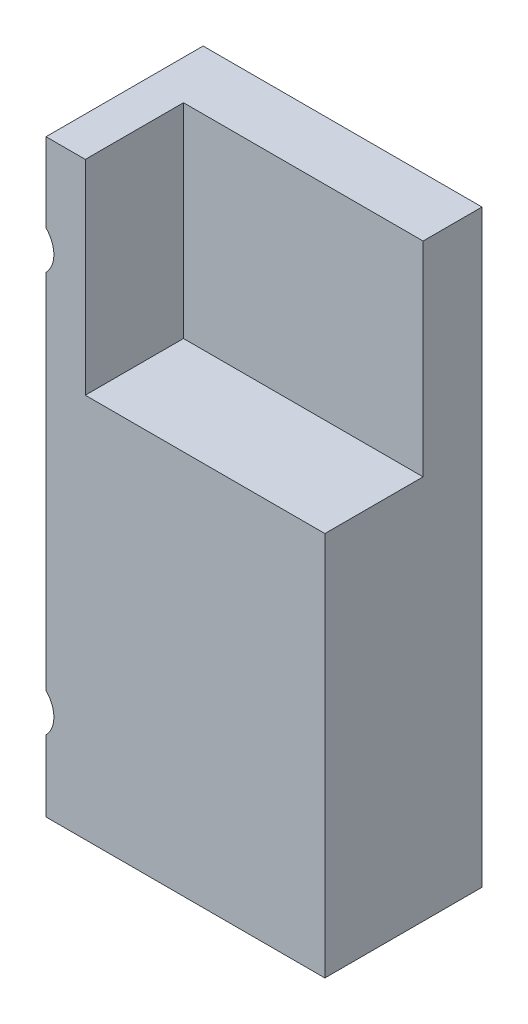
ISO-10303-21;
HEADER;
FILE_DESCRIPTION(('STEP AP214'),'2;1');
FILE_NAME('part.step','',(''),(''),'','','');
FILE_SCHEMA(('AUTOMOTIVE_DESIGN { 1 0 10303 214 1 1 1 1 }'));
ENDSEC;
DATA;
#1=APPLICATION_CONTEXT('core data for automotive mechanical design processes');
#2=APPLICATION_PROTOCOL_DEFINITION('international standard','automotive_design',2000,#1);
#3=PRODUCT_CONTEXT('',#1,'mechanical');
#4=PRODUCT('Part','Part','',(#3));
#5=PRODUCT_RELATED_PRODUCT_CATEGORY('part','',(#4));
#6=PRODUCT_DEFINITION_FORMATION('','',#4);
#7=PRODUCT_DEFINITION_CONTEXT('part definition',#1,'design');
#8=PRODUCT_DEFINITION('design','',#6,#7);
#9=PRODUCT_DEFINITION_SHAPE('','',#8);
#10=(LENGTH_UNIT() NAMED_UNIT(*) SI_UNIT(.MILLI.,.METRE.));
#11=(NAMED_UNIT(*) PLANE_ANGLE_UNIT() SI_UNIT($,.RADIAN.));
#12=(NAMED_UNIT(*) SI_UNIT($,.STERADIAN.) SOLID_ANGLE_UNIT());
#13=UNCERTAINTY_MEASURE_WITH_UNIT(LENGTH_MEASURE(1.E-05),#10,'distance_accuracy_value','');
#14=(GEOMETRIC_REPRESENTATION_CONTEXT(3) GLOBAL_UNCERTAINTY_ASSIGNED_CONTEXT((#13)) GLOBAL_UNIT_ASSIGNED_CONTEXT((#10,
#11,#12)) REPRESENTATION_CONTEXT('',''));
#15=CARTESIAN_POINT('',(0.,0.,0.));
#16=DIRECTION('',(0.,0.,1.));
#17=DIRECTION('',(1.,0.,0.));
#18=AXIS2_PLACEMENT_3D('',#15,#16,#17);
#19=CARTESIAN_POINT('',(-7.06427759792682,9.69793994413408,3.81));
#20=DIRECTION('',(1.,0.,0.));
#21=DIRECTION('',(0.,1.,0.));
#22=AXIS2_PLACEMENT_3D('',#19,#20,#21);
#23=PLANE('',#22);
#24=DIRECTION('',(0.,0.,-1.));
#25=VECTOR('',#24,1.);
#26=CARTESIAN_POINT('',(-7.06427759792682,2.10359915480021,12.192));
#27=LINE('',#26,#25);
#28=CARTESIAN_POINT('',(-7.06427759792682,2.10359915480021,0.));
#29=VERTEX_POINT('',#28);
#30=CARTESIAN_POINT('',(-7.06427759792682,2.10359915480022,10.16));
#31=VERTEX_POINT('',#30);
#32=EDGE_CURVE('E55',#29,#31,#27,.F.);
#33=ORIENTED_EDGE('',*,*,#32,.F.);
#34=DIRECTION('',(0.,-1.,0.));
#35=VECTOR('',#34,1.);
#36=CARTESIAN_POINT('',(-7.06427759792682,9.69793994413408,0.));
#37=LINE('',#36,#35);
#38=CARTESIAN_POINT('',(-7.06427759792682,-21.3157192665321,0.));
#39=VERTEX_POINT('',#38);
#40=EDGE_CURVE('E128',#29,#39,#37,.T.);
#41=ORIENTED_EDGE('',*,*,#40,.T.);
#42=DIRECTION('',(0.,0.,-1.));
#43=VECTOR('',#42,1.);
#44=CARTESIAN_POINT('',(-7.06427759792682,-21.3157192665321,12.192));
#45=LINE('',#44,#43);
#46=CARTESIAN_POINT('',(-7.06427759792682,-21.3157192665321,10.16));
#47=VERTEX_POINT('',#46);
#48=EDGE_CURVE('E113',#47,#39,#45,.T.);
#49=ORIENTED_EDGE('',*,*,#48,.F.);
#50=DIRECTION('',(0.,-1.,0.));
#51=VECTOR('',#50,1.);
#52=CARTESIAN_POINT('',(-7.06427759792682,-28.4020600558659,10.16));
#53=LINE('',#52,#51);
#54=EDGE_CURVE('E190',#31,#47,#53,.T.);
#55=ORIENTED_EDGE('',*,*,#54,.F.);
#56=EDGE_LOOP('',(#33,#41,#49,#55));
#57=FACE_BOUND('',#56,.T.);
#58=ADVANCED_FACE('F33',(#57),#23,.F.);
#59=DIRECTION('',(0.,0.,-1.));
#60=VECTOR('',#59,1.);
#61=CARTESIAN_POINT('',(-7.06427759792682,4.59228073346794,12.192));
#62=LINE('',#61,#60);
#63=CARTESIAN_POINT('',(-7.06427759792682,4.59228073346794,10.16));
#64=VERTEX_POINT('',#63);
#65=CARTESIAN_POINT('',(-7.06427759792682,4.59228073346794,0.));
#66=VERTEX_POINT('',#65);
#67=EDGE_CURVE('E201',#64,#66,#62,.T.);
#68=ORIENTED_EDGE('',*,*,#67,.F.);
#69=CARTESIAN_POINT('',(-7.06427759792682,9.69793994413408,10.16));
#70=VERTEX_POINT('',#69);
#71=EDGE_CURVE('E187',#70,#64,#53,.T.);
#72=ORIENTED_EDGE('',*,*,#71,.F.);
#73=DIRECTION('',(0.,0.,-1.));
#74=VECTOR('',#73,1.);
#75=CARTESIAN_POINT('',(-7.06427759792682,9.69793994413408,3.81));
#76=LINE('',#75,#74);
#77=CARTESIAN_POINT('',(-7.06427759792682,9.69793994413408,0.));
#78=VERTEX_POINT('',#77);
#79=EDGE_CURVE('E143',#70,#78,#76,.T.);
#80=ORIENTED_EDGE('',*,*,#79,.T.);
#81=EDGE_CURVE('E132',#78,#66,#37,.T.);
#82=ORIENTED_EDGE('',*,*,#81,.T.);
#83=EDGE_LOOP('',(#68,#72,#80,#82));
#84=FACE_BOUND('',#83,.T.);
#85=ADVANCED_FACE('F206',(#84),#23,.F.);
#86=DIRECTION('',(0.,0.,-1.));
#87=VECTOR('',#86,1.);
#88=CARTESIAN_POINT('',(-7.06427759792682,-23.8044008451998,12.192));
#89=LINE('',#88,#87);
#90=CARTESIAN_POINT('',(-7.06427759792682,-23.8044008451998,0.));
#91=VERTEX_POINT('',#90);
#92=CARTESIAN_POINT('',(-7.06427759792682,-23.8044008451998,10.16));
#93=VERTEX_POINT('',#92);
#94=EDGE_CURVE('E48',#91,#93,#89,.F.);
#95=ORIENTED_EDGE('',*,*,#94,.F.);
#96=CARTESIAN_POINT('',(-7.06427759792682,-28.4020600558659,0.));
#97=VERTEX_POINT('',#96);
#98=EDGE_CURVE('E130',#91,#97,#37,.T.);
#99=ORIENTED_EDGE('',*,*,#98,.T.);
#100=DIRECTION('',(0.,0.,-1.));
#101=VECTOR('',#100,1.);
#102=CARTESIAN_POINT('',(-7.06427759792682,-28.4020600558659,3.81));
#103=LINE('',#102,#101);
#104=CARTESIAN_POINT('',(-7.06427759792682,-28.4020600558659,10.16));
#105=VERTEX_POINT('',#104);
#106=EDGE_CURVE('E140',#105,#97,#103,.T.);
#107=ORIENTED_EDGE('',*,*,#106,.F.);
#108=EDGE_CURVE('E179',#93,#105,#53,.T.);
#109=ORIENTED_EDGE('',*,*,#108,.F.);
#110=EDGE_LOOP('',(#95,#99,#107,#109));
#111=FACE_BOUND('',#110,.T.);
#112=ADVANCED_FACE('F228',(#111),#23,.F.);
#113=CARTESIAN_POINT('',(0.,0.,3.81));
#114=DIRECTION('',(0.,0.,-1.));
#115=DIRECTION('',(-1.,0.,0.));
#116=AXIS2_PLACEMENT_3D('',#113,#114,#115);
#117=PLANE('',#116);
#118=DIRECTION('',(0.,1.,0.));
#119=VECTOR('',#118,1.);
#120=CARTESIAN_POINT('',(-4.52427759792682,-28.4020600558659,3.81));
#121=LINE('',#120,#119);
#122=CARTESIAN_POINT('',(-4.52427759792682,-3.51006005586593,3.81));
#123=VERTEX_POINT('',#122);
#124=CARTESIAN_POINT('',(-4.52427759792682,9.69793994413408,3.81));
#125=VERTEX_POINT('',#124);
#126=EDGE_CURVE('E177',#123,#125,#121,.T.);
#127=ORIENTED_EDGE('',*,*,#126,.F.);
#128=DIRECTION('',(-1.,0.,0.));
#129=VECTOR('',#128,1.);
#130=CARTESIAN_POINT('',(10.9697224020732,-3.51006005586593,3.81));
#131=LINE('',#130,#129);
#132=CARTESIAN_POINT('',(10.9697224020732,-3.51006005586593,3.81));
#133=VERTEX_POINT('',#132);
#134=EDGE_CURVE('E193',#133,#123,#131,.T.);
#135=ORIENTED_EDGE('',*,*,#134,.F.);
#136=DIRECTION('',(0.,-1.,0.));
#137=VECTOR('',#136,1.);
#138=CARTESIAN_POINT('',(10.9697224020732,9.69793994413408,3.81));
#139=LINE('',#138,#137);
#140=CARTESIAN_POINT('',(10.9697224020732,9.69793994413408,3.81));
#141=VERTEX_POINT('',#140);
#142=EDGE_CURVE('E135',#141,#133,#139,.T.);
#143=ORIENTED_EDGE('',*,*,#142,.F.);
#144=DIRECTION('',(1.,0.,0.));
#145=VECTOR('',#144,1.);
#146=CARTESIAN_POINT('',(-7.06427759792682,9.69793994413408,3.81));
#147=LINE('',#146,#145);
#148=EDGE_CURVE('E144',#125,#141,#147,.T.);
#149=ORIENTED_EDGE('',*,*,#148,.F.);
#150=EDGE_LOOP('',(#127,#135,#143,#149));
#151=FACE_BOUND('',#150,.T.);
#152=ADVANCED_FACE('F223',(#151),#117,.F.);
#153=CARTESIAN_POINT('',(-4.52427759792682,-28.4020600558659,10.16));
#154=DIRECTION('',(-1.,0.,0.));
#155=DIRECTION('',(0.,0.,1.));
#156=AXIS2_PLACEMENT_3D('',#153,#154,#155);
#157=PLANE('',#156);
#158=DIRECTION('',(0.,0.,-1.));
#159=VECTOR('',#158,1.);
#160=CARTESIAN_POINT('',(-4.52427759792682,-3.51006005586593,10.16));
#161=LINE('',#160,#159);
#162=CARTESIAN_POINT('',(-4.52427759792682,-3.51006005586593,10.16));
#163=VERTEX_POINT('',#162);
#164=EDGE_CURVE('E195',#163,#123,#161,.T.);
#165=ORIENTED_EDGE('',*,*,#164,.T.);
#166=ORIENTED_EDGE('',*,*,#126,.T.);
#167=DIRECTION('',(0.,0.,-1.));
#168=VECTOR('',#167,1.);
#169=CARTESIAN_POINT('',(-4.52427759792682,9.69793994413408,10.16));
#170=LINE('',#169,#168);
#171=CARTESIAN_POINT('',(-4.52427759792682,9.69793994413408,10.16));
#172=VERTEX_POINT('',#171);
#173=EDGE_CURVE('E166',#172,#125,#170,.T.);
#174=ORIENTED_EDGE('',*,*,#173,.F.);
#175=DIRECTION('',(0.,1.,0.));
#176=VECTOR('',#175,1.);
#177=CARTESIAN_POINT('',(-4.52427759792682,-28.4020600558659,10.16));
#178=LINE('',#177,#176);
#179=EDGE_CURVE('E183',#163,#172,#178,.T.);
#180=ORIENTED_EDGE('',*,*,#179,.F.);
#181=EDGE_LOOP('',(#165,#166,#174,#180));
#182=FACE_BOUND('',#181,.T.);
#183=ADVANCED_FACE('F217',(#182),#157,.F.);
#184=CARTESIAN_POINT('',(-7.06427759792682,-28.4020600558659,3.81));
#185=DIRECTION('',(0.,1.,0.));
#186=DIRECTION('',(0.,0.,1.));
#187=AXIS2_PLACEMENT_3D('',#184,#185,#186);
#188=PLANE('',#187);
#189=DIRECTION('',(1.,0.,0.));
#190=VECTOR('',#189,1.);
#191=CARTESIAN_POINT('',(-7.06427759792682,-28.4020600558659,0.));
#192=LINE('',#191,#190);
#193=CARTESIAN_POINT('',(10.9697224020732,-28.4020600558659,0.));
#194=VERTEX_POINT('',#193);
#195=EDGE_CURVE('E164',#97,#194,#192,.T.);
#196=ORIENTED_EDGE('',*,*,#195,.T.);
#197=DIRECTION('',(0.,0.,-1.));
#198=VECTOR('',#197,1.);
#199=CARTESIAN_POINT('',(10.9697224020732,-28.4020600558659,3.81));
#200=LINE('',#199,#198);
#201=CARTESIAN_POINT('',(10.9697224020732,-28.4020600558659,10.16));
#202=VERTEX_POINT('',#201);
#203=EDGE_CURVE('E148',#202,#194,#200,.T.);
#204=ORIENTED_EDGE('',*,*,#203,.F.);
#205=DIRECTION('',(1.,0.,0.));
#206=VECTOR('',#205,1.);
#207=CARTESIAN_POINT('',(-7.06427759792682,-28.4020600558659,10.16));
#208=LINE('',#207,#206);
#209=EDGE_CURVE('E185',#105,#202,#208,.T.);
#210=ORIENTED_EDGE('',*,*,#209,.F.);
#211=ORIENTED_EDGE('',*,*,#106,.T.);
#212=EDGE_LOOP('',(#196,#204,#210,#211));
#213=FACE_BOUND('',#212,.T.);
#214=ADVANCED_FACE('F35',(#213),#188,.F.);
#215=CARTESIAN_POINT('',(10.9697224020732,9.69793994413408,3.81));
#216=DIRECTION('',(1.,0.,0.));
#217=DIRECTION('',(0.,1.,0.));
#218=AXIS2_PLACEMENT_3D('',#215,#216,#217);
#219=PLANE('',#218);
#220=DIRECTION('',(0.,-1.,0.));
#221=VECTOR('',#220,1.);
#222=CARTESIAN_POINT('',(10.9697224020732,9.69793994413408,0.));
#223=LINE('',#222,#221);
#224=CARTESIAN_POINT('',(10.9697224020732,9.69793994413408,0.));
#225=VERTEX_POINT('',#224);
#226=EDGE_CURVE('E157',#225,#194,#223,.T.);
#227=ORIENTED_EDGE('',*,*,#226,.F.);
#228=DIRECTION('',(0.,0.,-1.));
#229=VECTOR('',#228,1.);
#230=CARTESIAN_POINT('',(10.9697224020732,9.69793994413408,3.81));
#231=LINE('',#230,#229);
#232=EDGE_CURVE('E146',#141,#225,#231,.T.);
#233=ORIENTED_EDGE('',*,*,#232,.F.);
#234=ORIENTED_EDGE('',*,*,#142,.T.);
#235=DIRECTION('',(0.,0.,-1.));
#236=VECTOR('',#235,1.);
#237=CARTESIAN_POINT('',(10.9697224020732,-3.51006005586593,10.16));
#238=LINE('',#237,#236);
#239=CARTESIAN_POINT('',(10.9697224020732,-3.51006005586593,10.16));
#240=VERTEX_POINT('',#239);
#241=EDGE_CURVE('E180',#240,#133,#238,.T.);
#242=ORIENTED_EDGE('',*,*,#241,.F.);
#243=DIRECTION('',(0.,1.,0.));
#244=VECTOR('',#243,1.);
#245=CARTESIAN_POINT('',(10.9697224020732,-28.4020600558659,10.16));
#246=LINE('',#245,#244);
#247=EDGE_CURVE('E161',#202,#240,#246,.T.);
#248=ORIENTED_EDGE('',*,*,#247,.F.);
#249=ORIENTED_EDGE('',*,*,#203,.T.);
#250=EDGE_LOOP('',(#227,#233,#234,#242,#248,#249));
#251=FACE_BOUND('',#250,.T.);
#252=ADVANCED_FACE('F154',(#251),#219,.T.);
#253=CARTESIAN_POINT('',(-7.06427759792682,9.69793994413408,3.81));
#254=DIRECTION('',(0.,1.,0.));
#255=DIRECTION('',(0.,0.,1.));
#256=AXIS2_PLACEMENT_3D('',#253,#254,#255);
#257=PLANE('',#256);
#258=DIRECTION('',(1.,0.,0.));
#259=VECTOR('',#258,1.);
#260=CARTESIAN_POINT('',(-7.06427759792682,9.69793994413408,0.));
#261=LINE('',#260,#259);
#262=EDGE_CURVE('E136',#78,#225,#261,.T.);
#263=ORIENTED_EDGE('',*,*,#262,.F.);
#264=ORIENTED_EDGE('',*,*,#79,.F.);
#265=DIRECTION('',(-1.,0.,0.));
#266=VECTOR('',#265,1.);
#267=CARTESIAN_POINT('',(-7.06427759792682,9.69793994413408,10.16));
#268=LINE('',#267,#266);
#269=EDGE_CURVE('E176',#172,#70,#268,.T.);
#270=ORIENTED_EDGE('',*,*,#269,.F.);
#271=ORIENTED_EDGE('',*,*,#173,.T.);
#272=ORIENTED_EDGE('',*,*,#148,.T.);
#273=ORIENTED_EDGE('',*,*,#232,.T.);
#274=EDGE_LOOP('',(#263,#264,#270,#271,#272,#273));
#275=FACE_BOUND('',#274,.T.);
#276=ADVANCED_FACE('F210',(#275),#257,.T.);
#277=CARTESIAN_POINT('',(0.,0.,0.));
#278=DIRECTION('',(0.,0.,-1.));
#279=DIRECTION('',(-1.,0.,0.));
#280=AXIS2_PLACEMENT_3D('',#277,#278,#279);
#281=PLANE('',#280);
#282=ORIENTED_EDGE('',*,*,#40,.F.);
#283=CARTESIAN_POINT('',(-8.33427759792682,3.34793994413408,0.));
#284=DIRECTION('',(0.,0.,1.));
#285=DIRECTION('',(1.,0.,0.));
#286=AXIS2_PLACEMENT_3D('',#283,#284,#285);
#287=CIRCLE('',#286,1.778);
#288=EDGE_CURVE('E121',#29,#66,#287,.T.);
#289=ORIENTED_EDGE('',*,*,#288,.T.);
#290=ORIENTED_EDGE('',*,*,#81,.F.);
#291=ORIENTED_EDGE('',*,*,#262,.T.);
#292=ORIENTED_EDGE('',*,*,#226,.T.);
#293=ORIENTED_EDGE('',*,*,#195,.F.);
#294=ORIENTED_EDGE('',*,*,#98,.F.);
#295=CARTESIAN_POINT('',(-8.33427759792682,-22.5600600558659,0.));
#296=DIRECTION('',(0.,0.,1.));
#297=DIRECTION('',(1.,0.,0.));
#298=AXIS2_PLACEMENT_3D('',#295,#296,#297);
#299=CIRCLE('',#298,1.778);
#300=EDGE_CURVE('E116',#91,#39,#299,.T.);
#301=ORIENTED_EDGE('',*,*,#300,.T.);
#302=EDGE_LOOP('',(#282,#289,#290,#291,#292,#293,#294,#301));
#303=FACE_BOUND('',#302,.T.);
#304=ADVANCED_FACE('F126',(#303),#281,.T.);
#305=CARTESIAN_POINT('',(0.,0.,10.16));
#306=DIRECTION('',(0.,0.,-1.));
#307=DIRECTION('',(-1.,0.,0.));
#308=AXIS2_PLACEMENT_3D('',#305,#306,#307);
#309=PLANE('',#308);
#310=ORIENTED_EDGE('',*,*,#209,.T.);
#311=ORIENTED_EDGE('',*,*,#247,.T.);
#312=DIRECTION('',(-1.,0.,0.));
#313=VECTOR('',#312,1.);
#314=CARTESIAN_POINT('',(10.9697224020732,-3.51006005586593,10.16));
#315=LINE('',#314,#313);
#316=EDGE_CURVE('E192',#240,#163,#315,.T.);
#317=ORIENTED_EDGE('',*,*,#316,.T.);
#318=ORIENTED_EDGE('',*,*,#179,.T.);
#319=ORIENTED_EDGE('',*,*,#269,.T.);
#320=ORIENTED_EDGE('',*,*,#71,.T.);
#321=CARTESIAN_POINT('',(-8.33427759792682,3.34793994413408,10.16));
#322=DIRECTION('',(0.,0.,-1.));
#323=DIRECTION('',(-1.,0.,0.));
#324=AXIS2_PLACEMENT_3D('',#321,#322,#323);
#325=CIRCLE('',#324,1.778);
#326=EDGE_CURVE('E11',#31,#64,#325,.F.);
#327=ORIENTED_EDGE('',*,*,#326,.F.);
#328=ORIENTED_EDGE('',*,*,#54,.T.);
#329=CARTESIAN_POINT('',(-8.33427759792682,-22.5600600558659,10.16));
#330=DIRECTION('',(0.,0.,-1.));
#331=DIRECTION('',(-1.,0.,0.));
#332=AXIS2_PLACEMENT_3D('',#329,#330,#331);
#333=CIRCLE('',#332,1.778);
#334=EDGE_CURVE('E41',#93,#47,#333,.F.);
#335=ORIENTED_EDGE('',*,*,#334,.F.);
#336=ORIENTED_EDGE('',*,*,#108,.T.);
#337=EDGE_LOOP('',(#310,#311,#317,#318,#319,#320,#327,#328,#335,#336));
#338=FACE_BOUND('',#337,.T.);
#339=ADVANCED_FACE('F212',(#338),#309,.F.);
#340=CARTESIAN_POINT('',(10.9697224020732,-3.51006005586593,10.16));
#341=DIRECTION('',(0.,-1.,0.));
#342=DIRECTION('',(1.,0.,0.));
#343=AXIS2_PLACEMENT_3D('',#340,#341,#342);
#344=PLANE('',#343);
#345=ORIENTED_EDGE('',*,*,#134,.T.);
#346=ORIENTED_EDGE('',*,*,#164,.F.);
#347=ORIENTED_EDGE('',*,*,#316,.F.);
#348=ORIENTED_EDGE('',*,*,#241,.T.);
#349=EDGE_LOOP('',(#345,#346,#347,#348));
#350=FACE_BOUND('',#349,.T.);
#351=ADVANCED_FACE('F225',(#350),#344,.F.);
#352=CARTESIAN_POINT('',(-8.33427759792682,-22.5600600558659,12.192));
#353=DIRECTION('',(0.,0.,-1.));
#354=DIRECTION('',(-1.,0.,0.));
#355=AXIS2_PLACEMENT_3D('',#352,#353,#354);
#356=CYLINDRICAL_SURFACE('',#355,1.778);
#357=ORIENTED_EDGE('',*,*,#94,.T.);
#358=ORIENTED_EDGE('',*,*,#334,.T.);
#359=ORIENTED_EDGE('',*,*,#48,.T.);
#360=ORIENTED_EDGE('',*,*,#300,.F.);
#361=EDGE_LOOP('',(#357,#358,#359,#360));
#362=FACE_BOUND('',#361,.T.);
#363=ADVANCED_FACE('F115',(#362),#356,.F.);
#364=CARTESIAN_POINT('',(-8.33427759792682,3.34793994413408,12.192));
#365=DIRECTION('',(0.,0.,-1.));
#366=DIRECTION('',(-1.,0.,0.));
#367=AXIS2_PLACEMENT_3D('',#364,#365,#366);
#368=CYLINDRICAL_SURFACE('',#367,1.778);
#369=ORIENTED_EDGE('',*,*,#32,.T.);
#370=ORIENTED_EDGE('',*,*,#326,.T.);
#371=ORIENTED_EDGE('',*,*,#67,.T.);
#372=ORIENTED_EDGE('',*,*,#288,.F.);
#373=EDGE_LOOP('',(#369,#370,#371,#372));
#374=FACE_BOUND('',#373,.T.);
#375=ADVANCED_FACE('F273',(#374),#368,.F.);
#376=CLOSED_SHELL('',(#58,#85,#112,#152,#183,#214,#252,#276,#304,#339,#351,#363,#375));
#377=MANIFOLD_SOLID_BREP('B2',#376);
#378=ADVANCED_BREP_SHAPE_REPRESENTATION('',(#18,#377),#14);
#379=SHAPE_DEFINITION_REPRESENTATION(#9,#378);
ENDSEC;
END-ISO-10303-21;
